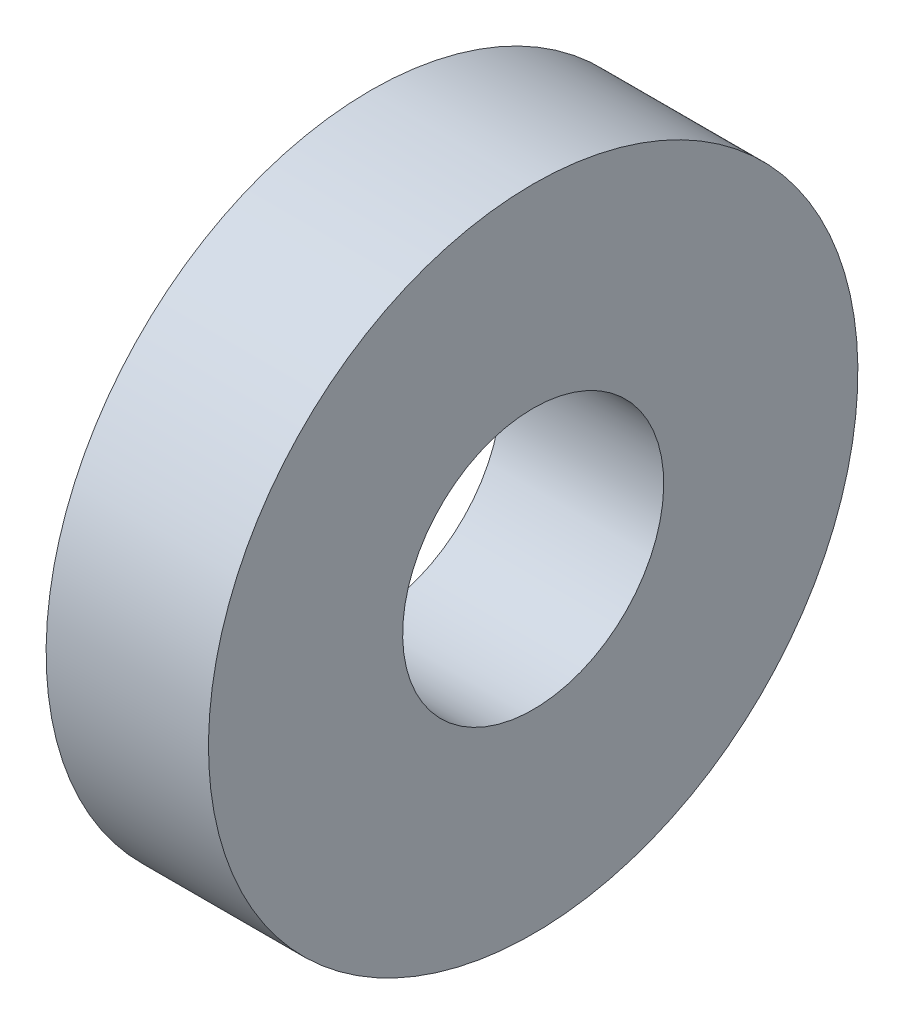
ISO-10303-21;
HEADER;
FILE_DESCRIPTION(('STEP AP214'),'2;1');
FILE_NAME('part.step','',(''),(''),'','','');
FILE_SCHEMA(('AUTOMOTIVE_DESIGN { 1 0 10303 214 1 1 1 1 }'));
ENDSEC;
DATA;
#1=APPLICATION_CONTEXT('core data for automotive mechanical design processes');
#2=APPLICATION_PROTOCOL_DEFINITION('international standard','automotive_design',2000,#1);
#3=PRODUCT_CONTEXT('',#1,'mechanical');
#4=PRODUCT('Part','Part','',(#3));
#5=PRODUCT_RELATED_PRODUCT_CATEGORY('part','',(#4));
#6=PRODUCT_DEFINITION_FORMATION('','',#4);
#7=PRODUCT_DEFINITION_CONTEXT('part definition',#1,'design');
#8=PRODUCT_DEFINITION('design','',#6,#7);
#9=PRODUCT_DEFINITION_SHAPE('','',#8);
#10=(LENGTH_UNIT() NAMED_UNIT(*) SI_UNIT(.MILLI.,.METRE.));
#11=(NAMED_UNIT(*) PLANE_ANGLE_UNIT() SI_UNIT($,.RADIAN.));
#12=(NAMED_UNIT(*) SI_UNIT($,.STERADIAN.) SOLID_ANGLE_UNIT());
#13=UNCERTAINTY_MEASURE_WITH_UNIT(LENGTH_MEASURE(1.E-05),#10,'distance_accuracy_value','');
#14=(GEOMETRIC_REPRESENTATION_CONTEXT(3) GLOBAL_UNCERTAINTY_ASSIGNED_CONTEXT((#13)) GLOBAL_UNIT_ASSIGNED_CONTEXT((#10,
#11,#12)) REPRESENTATION_CONTEXT('',''));
#15=CARTESIAN_POINT('',(0.,0.,0.));
#16=DIRECTION('',(0.,0.,1.));
#17=DIRECTION('',(1.,0.,0.));
#18=AXIS2_PLACEMENT_3D('',#15,#16,#17);
#19=CARTESIAN_POINT('',(349.25,-142.016295077605,374.65));
#20=DIRECTION('',(-1.,0.,0.));
#21=DIRECTION('',(0.,-1.,0.));
#22=AXIS2_PLACEMENT_3D('',#19,#20,#21);
#23=CYLINDRICAL_SURFACE('',#22,2.5527);
#24=CARTESIAN_POINT('',(349.25,-142.016295077605,374.65));
#25=DIRECTION('',(1.,0.,0.));
#26=DIRECTION('',(0.,1.,0.));
#27=AXIS2_PLACEMENT_3D('',#24,#25,#26);
#28=CIRCLE('',#27,2.5527);
#29=CARTESIAN_POINT('',(349.25,-139.463595077605,374.65));
#30=VERTEX_POINT('',#29);
#31=EDGE_CURVE('E23',#30,#30,#28,.T.);
#32=ORIENTED_EDGE('',*,*,#31,.T.);
#33=EDGE_LOOP('',(#32));
#34=FACE_BOUND('',#33,.T.);
#35=CARTESIAN_POINT('',(346.075,-142.016295077605,374.65));
#36=DIRECTION('',(1.,0.,0.));
#37=DIRECTION('',(0.,1.,0.));
#38=AXIS2_PLACEMENT_3D('',#35,#36,#37);
#39=CIRCLE('',#38,2.5527);
#40=CARTESIAN_POINT('',(346.075,-139.463595077605,374.65));
#41=VERTEX_POINT('',#40);
#42=EDGE_CURVE('E32',#41,#41,#39,.T.);
#43=ORIENTED_EDGE('',*,*,#42,.F.);
#44=EDGE_LOOP('',(#43));
#45=FACE_BOUND('',#44,.T.);
#46=ADVANCED_FACE('F15',(#34,#45),#23,.F.);
#47=CARTESIAN_POINT('',(349.25,-142.016295077605,374.65));
#48=DIRECTION('',(-1.,0.,0.));
#49=DIRECTION('',(0.,-1.,0.));
#50=AXIS2_PLACEMENT_3D('',#47,#48,#49);
#51=CYLINDRICAL_SURFACE('',#50,6.35);
#52=CARTESIAN_POINT('',(349.25,-142.016295077605,374.65));
#53=DIRECTION('',(1.,0.,0.));
#54=DIRECTION('',(0.,1.,0.));
#55=AXIS2_PLACEMENT_3D('',#52,#53,#54);
#56=CIRCLE('',#55,6.35);
#57=CARTESIAN_POINT('',(349.25,-135.666295077605,374.65));
#58=VERTEX_POINT('',#57);
#59=EDGE_CURVE('E10',#58,#58,#56,.T.);
#60=ORIENTED_EDGE('',*,*,#59,.F.);
#61=EDGE_LOOP('',(#60));
#62=FACE_BOUND('',#61,.T.);
#63=CARTESIAN_POINT('',(346.075,-142.016295077605,374.65));
#64=DIRECTION('',(1.,0.,0.));
#65=DIRECTION('',(0.,1.,0.));
#66=AXIS2_PLACEMENT_3D('',#63,#64,#65);
#67=CIRCLE('',#66,6.35);
#68=CARTESIAN_POINT('',(346.075,-135.666295077605,374.65));
#69=VERTEX_POINT('',#68);
#70=EDGE_CURVE('E18',#69,#69,#67,.T.);
#71=ORIENTED_EDGE('',*,*,#70,.T.);
#72=EDGE_LOOP('',(#71));
#73=FACE_BOUND('',#72,.T.);
#74=ADVANCED_FACE('F40',(#62,#73),#51,.T.);
#75=CARTESIAN_POINT('',(349.25,-54.7037950776034,404.8125));
#76=DIRECTION('',(1.,0.,0.));
#77=DIRECTION('',(0.,1.,0.));
#78=AXIS2_PLACEMENT_3D('',#75,#76,#77);
#79=PLANE('',#78);
#80=ORIENTED_EDGE('',*,*,#31,.F.);
#81=EDGE_LOOP('',(#80));
#82=FACE_BOUND('',#81,.T.);
#83=ORIENTED_EDGE('',*,*,#59,.T.);
#84=EDGE_LOOP('',(#83));
#85=FACE_BOUND('',#84,.T.);
#86=ADVANCED_FACE('F44',(#82,#85),#79,.T.);
#87=CARTESIAN_POINT('',(346.075,-54.7037950776034,404.8125));
#88=DIRECTION('',(1.,0.,0.));
#89=DIRECTION('',(0.,1.,0.));
#90=AXIS2_PLACEMENT_3D('',#87,#88,#89);
#91=PLANE('',#90);
#92=ORIENTED_EDGE('',*,*,#42,.T.);
#93=EDGE_LOOP('',(#92));
#94=FACE_BOUND('',#93,.T.);
#95=ORIENTED_EDGE('',*,*,#70,.F.);
#96=EDGE_LOOP('',(#95));
#97=FACE_BOUND('',#96,.T.);
#98=ADVANCED_FACE('F42',(#94,#97),#91,.F.);
#99=CLOSED_SHELL('',(#46,#74,#86,#98));
#100=MANIFOLD_SOLID_BREP('B1',#99);
#101=ADVANCED_BREP_SHAPE_REPRESENTATION('',(#18,#100),#14);
#102=SHAPE_DEFINITION_REPRESENTATION(#9,#101);
ENDSEC;
END-ISO-10303-21;
